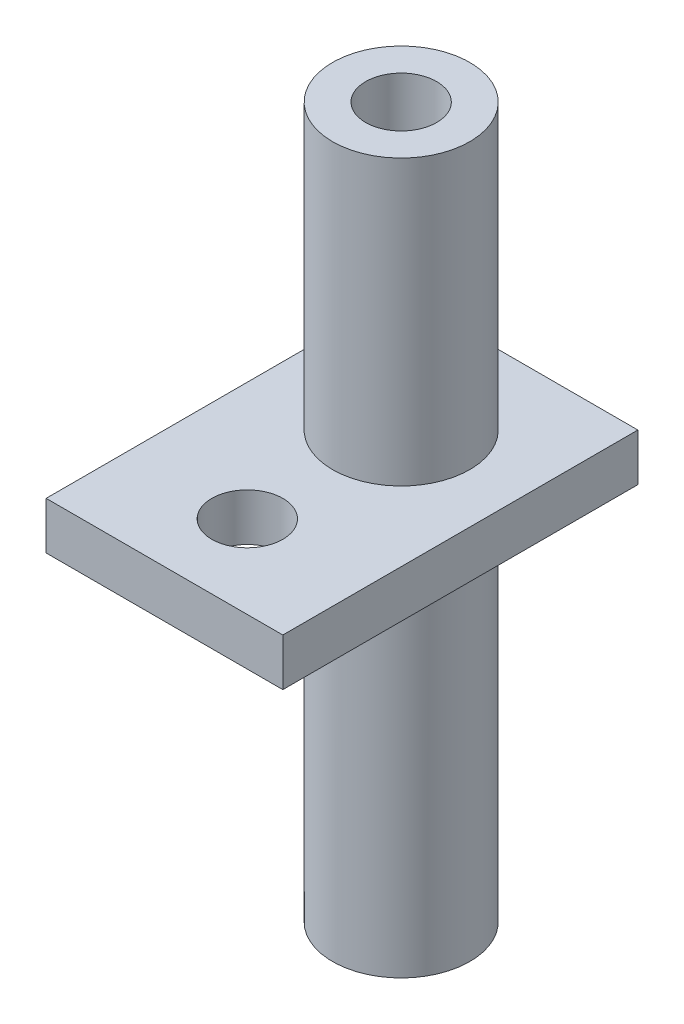
ISO-10303-21;
HEADER;
FILE_DESCRIPTION(('STEP AP214'),'2;1');
FILE_NAME('part.step','',(''),(''),'','','');
FILE_SCHEMA(('AUTOMOTIVE_DESIGN { 1 0 10303 214 1 1 1 1 }'));
ENDSEC;
DATA;
#1=APPLICATION_CONTEXT('core data for automotive mechanical design processes');
#2=APPLICATION_PROTOCOL_DEFINITION('international standard','automotive_design',2000,#1);
#3=PRODUCT_CONTEXT('',#1,'mechanical');
#4=PRODUCT('Part','Part','',(#3));
#5=PRODUCT_RELATED_PRODUCT_CATEGORY('part','',(#4));
#6=PRODUCT_DEFINITION_FORMATION('','',#4);
#7=PRODUCT_DEFINITION_CONTEXT('part definition',#1,'design');
#8=PRODUCT_DEFINITION('design','',#6,#7);
#9=PRODUCT_DEFINITION_SHAPE('','',#8);
#10=(LENGTH_UNIT() NAMED_UNIT(*) SI_UNIT(.MILLI.,.METRE.));
#11=(NAMED_UNIT(*) PLANE_ANGLE_UNIT() SI_UNIT($,.RADIAN.));
#12=(NAMED_UNIT(*) SI_UNIT($,.STERADIAN.) SOLID_ANGLE_UNIT());
#13=UNCERTAINTY_MEASURE_WITH_UNIT(LENGTH_MEASURE(1.E-05),#10,'distance_accuracy_value','');
#14=(GEOMETRIC_REPRESENTATION_CONTEXT(3) GLOBAL_UNCERTAINTY_ASSIGNED_CONTEXT((#13)) GLOBAL_UNIT_ASSIGNED_CONTEXT((#10,
#11,#12)) REPRESENTATION_CONTEXT('',''));
#15=CARTESIAN_POINT('',(0.,0.,0.));
#16=DIRECTION('',(0.,0.,1.));
#17=DIRECTION('',(1.,0.,0.));
#18=AXIS2_PLACEMENT_3D('',#15,#16,#17);
#19=CARTESIAN_POINT('',(0.,40.,0.));
#20=DIRECTION('',(0.,-1.,0.));
#21=DIRECTION('',(0.,0.,-1.));
#22=AXIS2_PLACEMENT_3D('',#19,#20,#21);
#23=CYLINDRICAL_SURFACE('',#22,2.9);
#24=CARTESIAN_POINT('',(0.,26.,0.));
#25=DIRECTION('',(0.,1.,0.));
#26=DIRECTION('',(0.,0.,1.));
#27=AXIS2_PLACEMENT_3D('',#24,#25,#26);
#28=CIRCLE('',#27,2.9);
#29=CARTESIAN_POINT('',(0.,26.,2.9));
#30=VERTEX_POINT('',#29);
#31=EDGE_CURVE('E11',#30,#30,#28,.T.);
#32=ORIENTED_EDGE('',*,*,#31,.F.);
#33=EDGE_LOOP('',(#32));
#34=FACE_BOUND('',#33,.T.);
#35=CARTESIAN_POINT('',(0.,10.,0.));
#36=DIRECTION('',(0.,-1.,0.));
#37=DIRECTION('',(0.,0.,-1.));
#38=AXIS2_PLACEMENT_3D('',#35,#36,#37);
#39=CIRCLE('',#38,2.9);
#40=CARTESIAN_POINT('',(0.,10.,-2.9));
#41=VERTEX_POINT('',#40);
#42=EDGE_CURVE('E324',#41,#41,#39,.T.);
#43=ORIENTED_EDGE('',*,*,#42,.F.);
#44=EDGE_LOOP('',(#43));
#45=FACE_BOUND('',#44,.T.);
#46=ADVANCED_FACE('F47',(#34,#45),#23,.T.);
#47=CARTESIAN_POINT('',(0.,26.,-5.));
#48=DIRECTION('',(0.,0.,1.));
#49=DIRECTION('',(1.,0.,0.));
#50=AXIS2_PLACEMENT_3D('',#47,#48,#49);
#51=PLANE('',#50);
#52=DIRECTION('',(1.,0.,0.));
#53=VECTOR('',#52,1.);
#54=CARTESIAN_POINT('',(0.,28.,-5.));
#55=LINE('',#54,#53);
#56=CARTESIAN_POINT('',(-5.,28.,-5.));
#57=VERTEX_POINT('',#56);
#58=CARTESIAN_POINT('',(5.,28.,-5.));
#59=VERTEX_POINT('',#58);
#60=EDGE_CURVE('E129',#57,#59,#55,.T.);
#61=ORIENTED_EDGE('',*,*,#60,.T.);
#62=DIRECTION('',(0.,1.,0.));
#63=VECTOR('',#62,1.);
#64=CARTESIAN_POINT('',(5.,26.,-5.));
#65=LINE('',#64,#63);
#66=CARTESIAN_POINT('',(5.,26.,-5.));
#67=VERTEX_POINT('',#66);
#68=EDGE_CURVE('E143',#67,#59,#65,.T.);
#69=ORIENTED_EDGE('',*,*,#68,.F.);
#70=DIRECTION('',(1.,0.,0.));
#71=VECTOR('',#70,1.);
#72=CARTESIAN_POINT('',(0.,26.,-5.));
#73=LINE('',#72,#71);
#74=CARTESIAN_POINT('',(-5.,26.,-5.));
#75=VERTEX_POINT('',#74);
#76=EDGE_CURVE('E116',#75,#67,#73,.T.);
#77=ORIENTED_EDGE('',*,*,#76,.F.);
#78=DIRECTION('',(0.,1.,0.));
#79=VECTOR('',#78,1.);
#80=CARTESIAN_POINT('',(-5.,26.,-5.));
#81=LINE('',#80,#79);
#82=EDGE_CURVE('E96',#75,#57,#81,.T.);
#83=ORIENTED_EDGE('',*,*,#82,.T.);
#84=EDGE_LOOP('',(#61,#69,#77,#83));
#85=FACE_BOUND('',#84,.T.);
#86=ADVANCED_FACE('F193',(#85),#51,.F.);
#87=CARTESIAN_POINT('',(5.,26.,0.));
#88=DIRECTION('',(-1.,0.,0.));
#89=DIRECTION('',(0.,0.,1.));
#90=AXIS2_PLACEMENT_3D('',#87,#88,#89);
#91=PLANE('',#90);
#92=DIRECTION('',(0.,0.,1.));
#93=VECTOR('',#92,1.);
#94=CARTESIAN_POINT('',(5.,28.,0.));
#95=LINE('',#94,#93);
#96=CARTESIAN_POINT('',(5.,28.,10.));
#97=VERTEX_POINT('',#96);
#98=EDGE_CURVE('E90',#59,#97,#95,.T.);
#99=ORIENTED_EDGE('',*,*,#98,.T.);
#100=DIRECTION('',(0.,1.,0.));
#101=VECTOR('',#100,1.);
#102=CARTESIAN_POINT('',(5.,26.,10.));
#103=LINE('',#102,#101);
#104=CARTESIAN_POINT('',(5.,26.,10.));
#105=VERTEX_POINT('',#104);
#106=EDGE_CURVE('E83',#105,#97,#103,.T.);
#107=ORIENTED_EDGE('',*,*,#106,.F.);
#108=DIRECTION('',(0.,0.,1.));
#109=VECTOR('',#108,1.);
#110=CARTESIAN_POINT('',(5.,26.,0.));
#111=LINE('',#110,#109);
#112=EDGE_CURVE('E67',#67,#105,#111,.T.);
#113=ORIENTED_EDGE('',*,*,#112,.F.);
#114=ORIENTED_EDGE('',*,*,#68,.T.);
#115=EDGE_LOOP('',(#99,#107,#113,#114));
#116=FACE_BOUND('',#115,.T.);
#117=ADVANCED_FACE('F198',(#116),#91,.F.);
#118=CARTESIAN_POINT('',(0.,26.,10.));
#119=DIRECTION('',(0.,0.,1.));
#120=DIRECTION('',(1.,0.,0.));
#121=AXIS2_PLACEMENT_3D('',#118,#119,#120);
#122=PLANE('',#121);
#123=DIRECTION('',(1.,0.,0.));
#124=VECTOR('',#123,1.);
#125=CARTESIAN_POINT('',(0.,28.,10.));
#126=LINE('',#125,#124);
#127=CARTESIAN_POINT('',(-5.,28.,10.));
#128=VERTEX_POINT('',#127);
#129=EDGE_CURVE('E103',#128,#97,#126,.T.);
#130=ORIENTED_EDGE('',*,*,#129,.F.);
#131=DIRECTION('',(0.,1.,0.));
#132=VECTOR('',#131,1.);
#133=CARTESIAN_POINT('',(-5.,26.,10.));
#134=LINE('',#133,#132);
#135=CARTESIAN_POINT('',(-5.,26.,10.));
#136=VERTEX_POINT('',#135);
#137=EDGE_CURVE('E99',#136,#128,#134,.T.);
#138=ORIENTED_EDGE('',*,*,#137,.F.);
#139=DIRECTION('',(1.,0.,0.));
#140=VECTOR('',#139,1.);
#141=CARTESIAN_POINT('',(0.,26.,10.));
#142=LINE('',#141,#140);
#143=EDGE_CURVE('E102',#136,#105,#142,.T.);
#144=ORIENTED_EDGE('',*,*,#143,.T.);
#145=ORIENTED_EDGE('',*,*,#106,.T.);
#146=EDGE_LOOP('',(#130,#138,#144,#145));
#147=FACE_BOUND('',#146,.T.);
#148=ADVANCED_FACE('F101',(#147),#122,.T.);
#149=CARTESIAN_POINT('',(-5.,26.,0.));
#150=DIRECTION('',(-1.,0.,0.));
#151=DIRECTION('',(0.,0.,1.));
#152=AXIS2_PLACEMENT_3D('',#149,#150,#151);
#153=PLANE('',#152);
#154=DIRECTION('',(0.,0.,1.));
#155=VECTOR('',#154,1.);
#156=CARTESIAN_POINT('',(-5.,28.,0.));
#157=LINE('',#156,#155);
#158=EDGE_CURVE('E133',#57,#128,#157,.T.);
#159=ORIENTED_EDGE('',*,*,#158,.F.);
#160=ORIENTED_EDGE('',*,*,#82,.F.);
#161=DIRECTION('',(0.,0.,1.));
#162=VECTOR('',#161,1.);
#163=CARTESIAN_POINT('',(-5.,26.,0.));
#164=LINE('',#163,#162);
#165=EDGE_CURVE('E111',#75,#136,#164,.T.);
#166=ORIENTED_EDGE('',*,*,#165,.T.);
#167=ORIENTED_EDGE('',*,*,#137,.T.);
#168=EDGE_LOOP('',(#159,#160,#166,#167));
#169=FACE_BOUND('',#168,.T.);
#170=ADVANCED_FACE('F114',(#169),#153,.T.);
#171=CARTESIAN_POINT('',(0.,26.,6.5));
#172=DIRECTION('',(0.,1.,0.));
#173=DIRECTION('',(0.,0.,1.));
#174=AXIS2_PLACEMENT_3D('',#171,#172,#173);
#175=CYLINDRICAL_SURFACE('',#174,1.5);
#176=CARTESIAN_POINT('',(0.,26.,6.5));
#177=DIRECTION('',(0.,1.,0.));
#178=DIRECTION('',(0.,0.,1.));
#179=AXIS2_PLACEMENT_3D('',#176,#177,#178);
#180=CIRCLE('',#179,1.5);
#181=CARTESIAN_POINT('',(0.,26.,8.));
#182=VERTEX_POINT('',#181);
#183=EDGE_CURVE('E125',#182,#182,#180,.T.);
#184=ORIENTED_EDGE('',*,*,#183,.F.);
#185=EDGE_LOOP('',(#184));
#186=FACE_BOUND('',#185,.T.);
#187=CARTESIAN_POINT('',(0.,28.,6.5));
#188=DIRECTION('',(0.,1.,0.));
#189=DIRECTION('',(0.,0.,1.));
#190=AXIS2_PLACEMENT_3D('',#187,#188,#189);
#191=CIRCLE('',#190,1.5);
#192=CARTESIAN_POINT('',(0.,28.,8.));
#193=VERTEX_POINT('',#192);
#194=EDGE_CURVE('E119',#193,#193,#191,.T.);
#195=ORIENTED_EDGE('',*,*,#194,.T.);
#196=EDGE_LOOP('',(#195));
#197=FACE_BOUND('',#196,.T.);
#198=ADVANCED_FACE('F190',(#186,#197),#175,.F.);
#199=CARTESIAN_POINT('',(0.,26.,0.));
#200=DIRECTION('',(0.,1.,0.));
#201=DIRECTION('',(0.,0.,1.));
#202=AXIS2_PLACEMENT_3D('',#199,#200,#201);
#203=PLANE('',#202);
#204=ORIENTED_EDGE('',*,*,#31,.T.);
#205=EDGE_LOOP('',(#204));
#206=FACE_BOUND('',#205,.T.);
#207=ORIENTED_EDGE('',*,*,#76,.T.);
#208=ORIENTED_EDGE('',*,*,#112,.T.);
#209=ORIENTED_EDGE('',*,*,#143,.F.);
#210=ORIENTED_EDGE('',*,*,#165,.F.);
#211=EDGE_LOOP('',(#207,#208,#209,#210));
#212=FACE_BOUND('',#211,.T.);
#213=ORIENTED_EDGE('',*,*,#183,.T.);
#214=EDGE_LOOP('',(#213));
#215=FACE_BOUND('',#214,.T.);
#216=ADVANCED_FACE('F109',(#206,#212,#215),#203,.F.);
#217=CARTESIAN_POINT('',(0.,28.,0.));
#218=DIRECTION('',(0.,1.,0.));
#219=DIRECTION('',(0.,0.,1.));
#220=AXIS2_PLACEMENT_3D('',#217,#218,#219);
#221=PLANE('',#220);
#222=CARTESIAN_POINT('',(0.,28.,0.));
#223=DIRECTION('',(0.,1.,0.));
#224=DIRECTION('',(0.,0.,1.));
#225=AXIS2_PLACEMENT_3D('',#222,#223,#224);
#226=CIRCLE('',#225,2.9);
#227=CARTESIAN_POINT('',(0.,28.,2.9));
#228=VERTEX_POINT('',#227);
#229=EDGE_CURVE('E146',#228,#228,#226,.T.);
#230=ORIENTED_EDGE('',*,*,#229,.F.);
#231=EDGE_LOOP('',(#230));
#232=FACE_BOUND('',#231,.T.);
#233=ORIENTED_EDGE('',*,*,#60,.F.);
#234=ORIENTED_EDGE('',*,*,#158,.T.);
#235=ORIENTED_EDGE('',*,*,#129,.T.);
#236=ORIENTED_EDGE('',*,*,#98,.F.);
#237=EDGE_LOOP('',(#233,#234,#235,#236));
#238=FACE_BOUND('',#237,.T.);
#239=ORIENTED_EDGE('',*,*,#194,.F.);
#240=EDGE_LOOP('',(#239));
#241=FACE_BOUND('',#240,.T.);
#242=ADVANCED_FACE('F189',(#232,#238,#241),#221,.T.);
#243=ORIENTED_EDGE('',*,*,#229,.T.);
#244=EDGE_LOOP('',(#243));
#245=FACE_BOUND('',#244,.T.);
#246=CARTESIAN_POINT('',(0.,40.,0.));
#247=DIRECTION('',(0.,1.,0.));
#248=DIRECTION('',(0.,0.,1.));
#249=AXIS2_PLACEMENT_3D('',#246,#247,#248);
#250=CIRCLE('',#249,2.9);
#251=CARTESIAN_POINT('',(0.,40.,2.9));
#252=VERTEX_POINT('',#251);
#253=EDGE_CURVE('E159',#252,#252,#250,.T.);
#254=ORIENTED_EDGE('',*,*,#253,.F.);
#255=EDGE_LOOP('',(#254));
#256=FACE_BOUND('',#255,.T.);
#257=ADVANCED_FACE('F49',(#245,#256),#23,.T.);
#258=CARTESIAN_POINT('',(0.,40.,0.));
#259=DIRECTION('',(0.,1.,0.));
#260=DIRECTION('',(0.,0.,1.));
#261=AXIS2_PLACEMENT_3D('',#258,#259,#260);
#262=PLANE('',#261);
#263=ORIENTED_EDGE('',*,*,#253,.T.);
#264=EDGE_LOOP('',(#263));
#265=FACE_BOUND('',#264,.T.);
#266=CARTESIAN_POINT('',(0.,40.,0.));
#267=DIRECTION('',(0.,1.,0.));
#268=DIRECTION('',(0.,0.,1.));
#269=AXIS2_PLACEMENT_3D('',#266,#267,#268);
#270=CIRCLE('',#269,1.5);
#271=CARTESIAN_POINT('',(0.,40.,1.5));
#272=VERTEX_POINT('',#271);
#273=EDGE_CURVE('E155',#272,#272,#270,.T.);
#274=ORIENTED_EDGE('',*,*,#273,.F.);
#275=EDGE_LOOP('',(#274));
#276=FACE_BOUND('',#275,.T.);
#277=ADVANCED_FACE('F204',(#265,#276),#262,.T.);
#278=CARTESIAN_POINT('',(0.,40.,0.));
#279=DIRECTION('',(0.,-1.,0.));
#280=DIRECTION('',(0.,0.,-1.));
#281=AXIS2_PLACEMENT_3D('',#278,#279,#280);
#282=CYLINDRICAL_SURFACE('',#281,1.5);
#283=CARTESIAN_POINT('',(0.,28.,0.));
#284=DIRECTION('',(0.,1.,0.));
#285=DIRECTION('',(0.,0.,1.));
#286=AXIS2_PLACEMENT_3D('',#283,#284,#285);
#287=CIRCLE('',#286,1.5);
#288=CARTESIAN_POINT('',(0.,28.,1.5));
#289=VERTEX_POINT('',#288);
#290=EDGE_CURVE('E58',#289,#289,#287,.T.);
#291=ORIENTED_EDGE('',*,*,#290,.F.);
#292=EDGE_LOOP('',(#291));
#293=FACE_BOUND('',#292,.T.);
#294=ORIENTED_EDGE('',*,*,#273,.T.);
#295=EDGE_LOOP('',(#294));
#296=FACE_BOUND('',#295,.T.);
#297=ADVANCED_FACE('F182',(#293,#296),#282,.F.);
#298=ORIENTED_EDGE('',*,*,#290,.T.);
#299=EDGE_LOOP('',(#298));
#300=FACE_BOUND('',#299,.T.);
#301=ADVANCED_FACE('F184',(#300),#221,.T.);
#302=CARTESIAN_POINT('',(0.,10.,0.));
#303=DIRECTION('',(0.,-1.,0.));
#304=DIRECTION('',(0.,0.,-1.));
#305=AXIS2_PLACEMENT_3D('',#302,#303,#304);
#306=PLANE('',#305);
#307=CARTESIAN_POINT('',(0.,10.,0.));
#308=DIRECTION('',(0.,-1.,0.));
#309=DIRECTION('',(0.,0.,-1.));
#310=AXIS2_PLACEMENT_3D('',#307,#308,#309);
#311=CIRCLE('',#310,1.5);
#312=CARTESIAN_POINT('',(0.,10.,-1.5));
#313=VERTEX_POINT('',#312);
#314=EDGE_CURVE('E51',#313,#313,#311,.T.);
#315=ORIENTED_EDGE('',*,*,#314,.F.);
#316=EDGE_LOOP('',(#315));
#317=FACE_BOUND('',#316,.T.);
#318=ORIENTED_EDGE('',*,*,#42,.T.);
#319=EDGE_LOOP('',(#318));
#320=FACE_BOUND('',#319,.T.);
#321=ADVANCED_FACE('F174',(#317,#320),#306,.T.);
#322=CARTESIAN_POINT('',(0.,26.,0.));
#323=DIRECTION('',(0.,1.,0.));
#324=DIRECTION('',(0.,0.,1.));
#325=AXIS2_PLACEMENT_3D('',#322,#323,#324);
#326=CIRCLE('',#325,1.5);
#327=CARTESIAN_POINT('',(0.,26.,1.5));
#328=VERTEX_POINT('',#327);
#329=EDGE_CURVE('E153',#328,#328,#326,.T.);
#330=ORIENTED_EDGE('',*,*,#329,.F.);
#331=EDGE_LOOP('',(#330));
#332=FACE_BOUND('',#331,.T.);
#333=ADVANCED_FACE('F172',(#332),#203,.F.);
#334=ORIENTED_EDGE('',*,*,#329,.T.);
#335=EDGE_LOOP('',(#334));
#336=FACE_BOUND('',#335,.T.);
#337=ORIENTED_EDGE('',*,*,#314,.T.);
#338=EDGE_LOOP('',(#337));
#339=FACE_BOUND('',#338,.T.);
#340=ADVANCED_FACE('F169',(#336,#339),#282,.F.);
#341=CLOSED_SHELL('',(#46,#86,#117,#148,#170,#198,#216,#242,#257,#277,#297,#301,#321,#333,#340));
#342=MANIFOLD_SOLID_BREP('B2',#341);
#343=ADVANCED_BREP_SHAPE_REPRESENTATION('',(#18,#342),#14);
#344=SHAPE_DEFINITION_REPRESENTATION(#9,#343);
ENDSEC;
END-ISO-10303-21;
